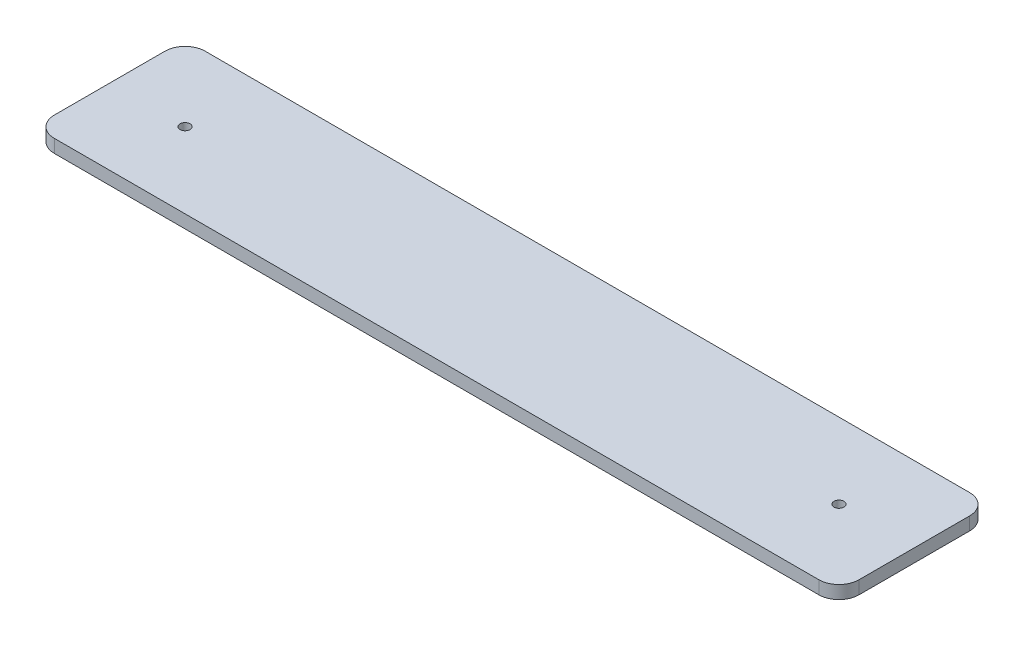
ISO-10303-21;
HEADER;
FILE_DESCRIPTION(('STEP AP214'),'2;1');
FILE_NAME('part.step','',(''),(''),'','','');
FILE_SCHEMA(('AUTOMOTIVE_DESIGN { 1 0 10303 214 1 1 1 1 }'));
ENDSEC;
DATA;
#1=APPLICATION_CONTEXT('core data for automotive mechanical design processes');
#2=APPLICATION_PROTOCOL_DEFINITION('international standard','automotive_design',2000,#1);
#3=PRODUCT_CONTEXT('',#1,'mechanical');
#4=PRODUCT('Part','Part','',(#3));
#5=PRODUCT_RELATED_PRODUCT_CATEGORY('part','',(#4));
#6=PRODUCT_DEFINITION_FORMATION('','',#4);
#7=PRODUCT_DEFINITION_CONTEXT('part definition',#1,'design');
#8=PRODUCT_DEFINITION('design','',#6,#7);
#9=PRODUCT_DEFINITION_SHAPE('','',#8);
#10=(LENGTH_UNIT() NAMED_UNIT(*) SI_UNIT(.MILLI.,.METRE.));
#11=(NAMED_UNIT(*) PLANE_ANGLE_UNIT() SI_UNIT($,.RADIAN.));
#12=(NAMED_UNIT(*) SI_UNIT($,.STERADIAN.) SOLID_ANGLE_UNIT());
#13=UNCERTAINTY_MEASURE_WITH_UNIT(LENGTH_MEASURE(1.E-05),#10,'distance_accuracy_value','');
#14=(GEOMETRIC_REPRESENTATION_CONTEXT(3) GLOBAL_UNCERTAINTY_ASSIGNED_CONTEXT((#13)) GLOBAL_UNIT_ASSIGNED_CONTEXT((#10,
#11,#12)) REPRESENTATION_CONTEXT('',''));
#15=CARTESIAN_POINT('',(0.,0.,0.));
#16=DIRECTION('',(0.,0.,1.));
#17=DIRECTION('',(1.,0.,0.));
#18=AXIS2_PLACEMENT_3D('',#15,#16,#17);
#19=CARTESIAN_POINT('',(0.,6.5,0.));
#20=DIRECTION('',(1.,0.,0.));
#21=DIRECTION('',(0.,0.,-1.));
#22=AXIS2_PLACEMENT_3D('',#19,#20,#21);
#23=PLANE('',#22);
#24=DIRECTION('',(0.,0.,1.));
#25=VECTOR('',#24,1.);
#26=CARTESIAN_POINT('',(0.,0.,0.));
#27=LINE('',#26,#25);
#28=CARTESIAN_POINT('',(0.,0.,-65.));
#29=VERTEX_POINT('',#28);
#30=CARTESIAN_POINT('',(0.,0.,-10.));
#31=VERTEX_POINT('',#30);
#32=EDGE_CURVE('E157',#29,#31,#27,.T.);
#33=ORIENTED_EDGE('',*,*,#32,.T.);
#34=DIRECTION('',(0.,-1.,0.));
#35=VECTOR('',#34,1.);
#36=CARTESIAN_POINT('',(0.,6.5,-10.));
#37=LINE('',#36,#35);
#38=CARTESIAN_POINT('',(0.,6.5,-10.));
#39=VERTEX_POINT('',#38);
#40=EDGE_CURVE('E11',#31,#39,#37,.F.);
#41=ORIENTED_EDGE('',*,*,#40,.T.);
#42=DIRECTION('',(0.,0.,1.));
#43=VECTOR('',#42,1.);
#44=CARTESIAN_POINT('',(0.,6.5,0.));
#45=LINE('',#44,#43);
#46=CARTESIAN_POINT('',(0.,6.5,-65.));
#47=VERTEX_POINT('',#46);
#48=EDGE_CURVE('E125',#47,#39,#45,.T.);
#49=ORIENTED_EDGE('',*,*,#48,.F.);
#50=DIRECTION('',(0.,-1.,0.));
#51=VECTOR('',#50,1.);
#52=CARTESIAN_POINT('',(0.,6.5,-65.));
#53=LINE('',#52,#51);
#54=EDGE_CURVE('E41',#47,#29,#53,.T.);
#55=ORIENTED_EDGE('',*,*,#54,.T.);
#56=EDGE_LOOP('',(#33,#41,#49,#55));
#57=FACE_BOUND('',#56,.T.);
#58=ADVANCED_FACE('F33',(#57),#23,.F.);
#59=CARTESIAN_POINT('',(0.,6.5,0.));
#60=DIRECTION('',(0.,0.,-1.));
#61=DIRECTION('',(-1.,0.,0.));
#62=AXIS2_PLACEMENT_3D('',#59,#60,#61);
#63=PLANE('',#62);
#64=DIRECTION('',(1.,0.,0.));
#65=VECTOR('',#64,1.);
#66=CARTESIAN_POINT('',(0.,0.,0.));
#67=LINE('',#66,#65);
#68=CARTESIAN_POINT('',(10.,0.,0.));
#69=VERTEX_POINT('',#68);
#70=CARTESIAN_POINT('',(390.,0.,0.));
#71=VERTEX_POINT('',#70);
#72=EDGE_CURVE('E130',#69,#71,#67,.T.);
#73=ORIENTED_EDGE('',*,*,#72,.T.);
#74=DIRECTION('',(0.,-1.,0.));
#75=VECTOR('',#74,1.);
#76=CARTESIAN_POINT('',(390.,6.5,0.));
#77=LINE('',#76,#75);
#78=CARTESIAN_POINT('',(390.,6.5,0.));
#79=VERTEX_POINT('',#78);
#80=EDGE_CURVE('E48',#71,#79,#77,.F.);
#81=ORIENTED_EDGE('',*,*,#80,.T.);
#82=DIRECTION('',(1.,0.,0.));
#83=VECTOR('',#82,1.);
#84=CARTESIAN_POINT('',(0.,6.5,0.));
#85=LINE('',#84,#83);
#86=CARTESIAN_POINT('',(10.,6.5,0.));
#87=VERTEX_POINT('',#86);
#88=EDGE_CURVE('E128',#87,#79,#85,.T.);
#89=ORIENTED_EDGE('',*,*,#88,.F.);
#90=DIRECTION('',(0.,-1.,0.));
#91=VECTOR('',#90,1.);
#92=CARTESIAN_POINT('',(10.,6.5,0.));
#93=LINE('',#92,#91);
#94=EDGE_CURVE('E149',#87,#69,#93,.T.);
#95=ORIENTED_EDGE('',*,*,#94,.T.);
#96=EDGE_LOOP('',(#73,#81,#89,#95));
#97=FACE_BOUND('',#96,.T.);
#98=ADVANCED_FACE('F196',(#97),#63,.F.);
#99=CARTESIAN_POINT('',(400.,6.5,0.));
#100=DIRECTION('',(-1.,0.,0.));
#101=DIRECTION('',(0.,0.,1.));
#102=AXIS2_PLACEMENT_3D('',#99,#100,#101);
#103=PLANE('',#102);
#104=DIRECTION('',(0.,0.,-1.));
#105=VECTOR('',#104,1.);
#106=CARTESIAN_POINT('',(400.,0.,0.));
#107=LINE('',#106,#105);
#108=CARTESIAN_POINT('',(400.,0.,-10.));
#109=VERTEX_POINT('',#108);
#110=CARTESIAN_POINT('',(400.,0.,-65.));
#111=VERTEX_POINT('',#110);
#112=EDGE_CURVE('E126',#109,#111,#107,.T.);
#113=ORIENTED_EDGE('',*,*,#112,.T.);
#114=DIRECTION('',(0.,-1.,0.));
#115=VECTOR('',#114,1.);
#116=CARTESIAN_POINT('',(400.,6.5,-65.));
#117=LINE('',#116,#115);
#118=CARTESIAN_POINT('',(400.,6.5,-65.));
#119=VERTEX_POINT('',#118);
#120=EDGE_CURVE('E104',#111,#119,#117,.F.);
#121=ORIENTED_EDGE('',*,*,#120,.T.);
#122=DIRECTION('',(0.,0.,-1.));
#123=VECTOR('',#122,1.);
#124=CARTESIAN_POINT('',(400.,6.5,0.));
#125=LINE('',#124,#123);
#126=CARTESIAN_POINT('',(400.,6.5,-10.));
#127=VERTEX_POINT('',#126);
#128=EDGE_CURVE('E169',#127,#119,#125,.T.);
#129=ORIENTED_EDGE('',*,*,#128,.F.);
#130=DIRECTION('',(0.,-1.,0.));
#131=VECTOR('',#130,1.);
#132=CARTESIAN_POINT('',(400.,6.5,-10.));
#133=LINE('',#132,#131);
#134=EDGE_CURVE('E109',#127,#109,#133,.T.);
#135=ORIENTED_EDGE('',*,*,#134,.T.);
#136=EDGE_LOOP('',(#113,#121,#129,#135));
#137=FACE_BOUND('',#136,.T.);
#138=ADVANCED_FACE('F193',(#137),#103,.F.);
#139=CARTESIAN_POINT('',(0.,6.5,-75.));
#140=DIRECTION('',(0.,0.,1.));
#141=DIRECTION('',(1.,0.,0.));
#142=AXIS2_PLACEMENT_3D('',#139,#140,#141);
#143=PLANE('',#142);
#144=DIRECTION('',(-1.,0.,0.));
#145=VECTOR('',#144,1.);
#146=CARTESIAN_POINT('',(0.,6.5,-75.));
#147=LINE('',#146,#145);
#148=CARTESIAN_POINT('',(390.,6.5,-75.));
#149=VERTEX_POINT('',#148);
#150=CARTESIAN_POINT('',(10.,6.5,-75.));
#151=VERTEX_POINT('',#150);
#152=EDGE_CURVE('E119',#149,#151,#147,.T.);
#153=ORIENTED_EDGE('',*,*,#152,.F.);
#154=DIRECTION('',(0.,-1.,0.));
#155=VECTOR('',#154,1.);
#156=CARTESIAN_POINT('',(390.,6.5,-75.));
#157=LINE('',#156,#155);
#158=CARTESIAN_POINT('',(390.,0.,-75.));
#159=VERTEX_POINT('',#158);
#160=EDGE_CURVE('E103',#149,#159,#157,.T.);
#161=ORIENTED_EDGE('',*,*,#160,.T.);
#162=DIRECTION('',(-1.,0.,0.));
#163=VECTOR('',#162,1.);
#164=CARTESIAN_POINT('',(0.,0.,-75.));
#165=LINE('',#164,#163);
#166=CARTESIAN_POINT('',(10.,0.,-75.));
#167=VERTEX_POINT('',#166);
#168=EDGE_CURVE('E116',#159,#167,#165,.T.);
#169=ORIENTED_EDGE('',*,*,#168,.T.);
#170=DIRECTION('',(0.,-1.,0.));
#171=VECTOR('',#170,1.);
#172=CARTESIAN_POINT('',(10.,6.5,-75.));
#173=LINE('',#172,#171);
#174=EDGE_CURVE('E121',#167,#151,#173,.F.);
#175=ORIENTED_EDGE('',*,*,#174,.T.);
#176=EDGE_LOOP('',(#153,#161,#169,#175));
#177=FACE_BOUND('',#176,.T.);
#178=ADVANCED_FACE('F115',(#177),#143,.F.);
#179=CARTESIAN_POINT('',(0.,6.5,0.));
#180=DIRECTION('',(0.,-1.,0.));
#181=DIRECTION('',(0.,0.,-1.));
#182=AXIS2_PLACEMENT_3D('',#179,#180,#181);
#183=PLANE('',#182);
#184=CARTESIAN_POINT('',(362.5,6.5,-37.5));
#185=DIRECTION('',(0.,1.,0.));
#186=DIRECTION('',(0.,0.,-1.));
#187=AXIS2_PLACEMENT_3D('',#184,#185,#186);
#188=CIRCLE('',#187,2.49999999999996);
#189=CARTESIAN_POINT('',(362.5,6.5,-35.0000000000001));
#190=VERTEX_POINT('',#189);
#191=EDGE_CURVE('E174',#190,#190,#188,.T.);
#192=ORIENTED_EDGE('',*,*,#191,.F.);
#193=EDGE_LOOP('',(#192));
#194=FACE_BOUND('',#193,.T.);
#195=CARTESIAN_POINT('',(37.5,6.5,-37.5));
#196=DIRECTION('',(0.,1.,0.));
#197=DIRECTION('',(0.,0.,1.));
#198=AXIS2_PLACEMENT_3D('',#195,#196,#197);
#199=CIRCLE('',#198,2.5);
#200=CARTESIAN_POINT('',(37.5,6.5,-35.));
#201=VERTEX_POINT('',#200);
#202=EDGE_CURVE('E162',#201,#201,#199,.T.);
#203=ORIENTED_EDGE('',*,*,#202,.F.);
#204=EDGE_LOOP('',(#203));
#205=FACE_BOUND('',#204,.T.);
#206=ORIENTED_EDGE('',*,*,#128,.T.);
#207=CARTESIAN_POINT('',(390.,6.5,-65.));
#208=DIRECTION('',(0.,-1.,0.));
#209=DIRECTION('',(0.,0.,-1.));
#210=AXIS2_PLACEMENT_3D('',#207,#208,#209);
#211=CIRCLE('',#210,10.);
#212=EDGE_CURVE('E147',#119,#149,#211,.F.);
#213=ORIENTED_EDGE('',*,*,#212,.T.);
#214=ORIENTED_EDGE('',*,*,#152,.T.);
#215=CARTESIAN_POINT('',(10.,6.5,-65.));
#216=DIRECTION('',(0.,-1.,0.));
#217=DIRECTION('',(0.,0.,-1.));
#218=AXIS2_PLACEMENT_3D('',#215,#216,#217);
#219=CIRCLE('',#218,10.);
#220=EDGE_CURVE('E142',#151,#47,#219,.F.);
#221=ORIENTED_EDGE('',*,*,#220,.T.);
#222=ORIENTED_EDGE('',*,*,#48,.T.);
#223=CARTESIAN_POINT('',(10.,6.5,-10.));
#224=DIRECTION('',(0.,-1.,0.));
#225=DIRECTION('',(0.,0.,-1.));
#226=AXIS2_PLACEMENT_3D('',#223,#224,#225);
#227=CIRCLE('',#226,10.);
#228=EDGE_CURVE('E55',#39,#87,#227,.F.);
#229=ORIENTED_EDGE('',*,*,#228,.T.);
#230=ORIENTED_EDGE('',*,*,#88,.T.);
#231=CARTESIAN_POINT('',(390.,6.5,-10.));
#232=DIRECTION('',(0.,-1.,0.));
#233=DIRECTION('',(0.,0.,-1.));
#234=AXIS2_PLACEMENT_3D('',#231,#232,#233);
#235=CIRCLE('',#234,10.);
#236=EDGE_CURVE('E145',#79,#127,#235,.F.);
#237=ORIENTED_EDGE('',*,*,#236,.T.);
#238=EDGE_LOOP('',(#206,#213,#214,#221,#222,#229,#230,#237));
#239=FACE_BOUND('',#238,.T.);
#240=ADVANCED_FACE('F184',(#194,#205,#239),#183,.F.);
#241=CARTESIAN_POINT('',(0.,0.,0.));
#242=DIRECTION('',(0.,-1.,0.));
#243=DIRECTION('',(0.,0.,-1.));
#244=AXIS2_PLACEMENT_3D('',#241,#242,#243);
#245=PLANE('',#244);
#246=CARTESIAN_POINT('',(362.5,0.,-37.5));
#247=DIRECTION('',(0.,-1.,0.));
#248=DIRECTION('',(0.,0.,-1.));
#249=AXIS2_PLACEMENT_3D('',#246,#247,#248);
#250=CIRCLE('',#249,2.49999999999996);
#251=CARTESIAN_POINT('',(362.5,0.,-35.0000000000001));
#252=VERTEX_POINT('',#251);
#253=EDGE_CURVE('E176',#252,#252,#250,.F.);
#254=ORIENTED_EDGE('',*,*,#253,.T.);
#255=EDGE_LOOP('',(#254));
#256=FACE_BOUND('',#255,.T.);
#257=CARTESIAN_POINT('',(37.5,0.,-37.5));
#258=DIRECTION('',(0.,-1.,0.));
#259=DIRECTION('',(0.,0.,-1.));
#260=AXIS2_PLACEMENT_3D('',#257,#258,#259);
#261=CIRCLE('',#260,2.5);
#262=CARTESIAN_POINT('',(37.5,0.,-35.));
#263=VERTEX_POINT('',#262);
#264=EDGE_CURVE('E165',#263,#263,#261,.F.);
#265=ORIENTED_EDGE('',*,*,#264,.T.);
#266=EDGE_LOOP('',(#265));
#267=FACE_BOUND('',#266,.T.);
#268=ORIENTED_EDGE('',*,*,#168,.F.);
#269=CARTESIAN_POINT('',(390.,0.,-65.));
#270=DIRECTION('',(0.,-1.,0.));
#271=DIRECTION('',(0.,0.,-1.));
#272=AXIS2_PLACEMENT_3D('',#269,#270,#271);
#273=CIRCLE('',#272,10.);
#274=EDGE_CURVE('E99',#159,#111,#273,.T.);
#275=ORIENTED_EDGE('',*,*,#274,.T.);
#276=ORIENTED_EDGE('',*,*,#112,.F.);
#277=CARTESIAN_POINT('',(390.,0.,-10.));
#278=DIRECTION('',(0.,-1.,0.));
#279=DIRECTION('',(0.,0.,-1.));
#280=AXIS2_PLACEMENT_3D('',#277,#278,#279);
#281=CIRCLE('',#280,10.);
#282=EDGE_CURVE('E110',#109,#71,#281,.T.);
#283=ORIENTED_EDGE('',*,*,#282,.T.);
#284=ORIENTED_EDGE('',*,*,#72,.F.);
#285=CARTESIAN_POINT('',(10.,0.,-10.));
#286=DIRECTION('',(0.,-1.,0.));
#287=DIRECTION('',(0.,0.,-1.));
#288=AXIS2_PLACEMENT_3D('',#285,#286,#287);
#289=CIRCLE('',#288,10.);
#290=EDGE_CURVE('E136',#69,#31,#289,.T.);
#291=ORIENTED_EDGE('',*,*,#290,.T.);
#292=ORIENTED_EDGE('',*,*,#32,.F.);
#293=CARTESIAN_POINT('',(10.,0.,-65.));
#294=DIRECTION('',(0.,-1.,0.));
#295=DIRECTION('',(0.,0.,-1.));
#296=AXIS2_PLACEMENT_3D('',#293,#294,#295);
#297=CIRCLE('',#296,10.);
#298=EDGE_CURVE('E120',#29,#167,#297,.T.);
#299=ORIENTED_EDGE('',*,*,#298,.T.);
#300=EDGE_LOOP('',(#268,#275,#276,#283,#284,#291,#292,#299));
#301=FACE_BOUND('',#300,.T.);
#302=ADVANCED_FACE('F123',(#256,#267,#301),#245,.T.);
#303=CARTESIAN_POINT('',(390.,6.5,-65.));
#304=DIRECTION('',(0.,-1.,0.));
#305=DIRECTION('',(0.,0.,-1.));
#306=AXIS2_PLACEMENT_3D('',#303,#304,#305);
#307=CYLINDRICAL_SURFACE('',#306,10.);
#308=ORIENTED_EDGE('',*,*,#212,.F.);
#309=ORIENTED_EDGE('',*,*,#120,.F.);
#310=ORIENTED_EDGE('',*,*,#274,.F.);
#311=ORIENTED_EDGE('',*,*,#160,.F.);
#312=EDGE_LOOP('',(#308,#309,#310,#311));
#313=FACE_BOUND('',#312,.T.);
#314=ADVANCED_FACE('F102',(#313),#307,.T.);
#315=CARTESIAN_POINT('',(390.,6.5,-10.));
#316=DIRECTION('',(0.,-1.,0.));
#317=DIRECTION('',(0.,0.,-1.));
#318=AXIS2_PLACEMENT_3D('',#315,#316,#317);
#319=CYLINDRICAL_SURFACE('',#318,10.);
#320=ORIENTED_EDGE('',*,*,#236,.F.);
#321=ORIENTED_EDGE('',*,*,#80,.F.);
#322=ORIENTED_EDGE('',*,*,#282,.F.);
#323=ORIENTED_EDGE('',*,*,#134,.F.);
#324=EDGE_LOOP('',(#320,#321,#322,#323));
#325=FACE_BOUND('',#324,.T.);
#326=ADVANCED_FACE('F195',(#325),#319,.T.);
#327=CARTESIAN_POINT('',(10.,6.5,-10.));
#328=DIRECTION('',(0.,-1.,0.));
#329=DIRECTION('',(0.,0.,-1.));
#330=AXIS2_PLACEMENT_3D('',#327,#328,#329);
#331=CYLINDRICAL_SURFACE('',#330,10.);
#332=ORIENTED_EDGE('',*,*,#228,.F.);
#333=ORIENTED_EDGE('',*,*,#40,.F.);
#334=ORIENTED_EDGE('',*,*,#290,.F.);
#335=ORIENTED_EDGE('',*,*,#94,.F.);
#336=EDGE_LOOP('',(#332,#333,#334,#335));
#337=FACE_BOUND('',#336,.T.);
#338=ADVANCED_FACE('F199',(#337),#331,.T.);
#339=CARTESIAN_POINT('',(10.,6.5,-65.));
#340=DIRECTION('',(0.,-1.,0.));
#341=DIRECTION('',(0.,0.,-1.));
#342=AXIS2_PLACEMENT_3D('',#339,#340,#341);
#343=CYLINDRICAL_SURFACE('',#342,10.);
#344=ORIENTED_EDGE('',*,*,#220,.F.);
#345=ORIENTED_EDGE('',*,*,#174,.F.);
#346=ORIENTED_EDGE('',*,*,#298,.F.);
#347=ORIENTED_EDGE('',*,*,#54,.F.);
#348=EDGE_LOOP('',(#344,#345,#346,#347));
#349=FACE_BOUND('',#348,.T.);
#350=ADVANCED_FACE('F35',(#349),#343,.T.);
#351=CARTESIAN_POINT('',(37.5,-0.00100000000000013,-37.5));
#352=DIRECTION('',(0.,1.,0.));
#353=DIRECTION('',(0.,0.,1.));
#354=AXIS2_PLACEMENT_3D('',#351,#352,#353);
#355=CYLINDRICAL_SURFACE('',#354,2.5);
#356=CARTESIAN_POINT('',(37.5,0.,-35.));
#357=CARTESIAN_POINT('',(37.5,0.0677083333333333,-35.));
#358=CARTESIAN_POINT('',(37.5,0.135416666666667,-35.));
#359=CARTESIAN_POINT('',(37.5,0.270833333333333,-35.));
#360=CARTESIAN_POINT('',(37.5,0.338541666666667,-35.));
#361=CARTESIAN_POINT('',(37.5,0.473958333333333,-35.));
#362=CARTESIAN_POINT('',(37.5,0.541666666666667,-35.));
#363=CARTESIAN_POINT('',(37.5,0.677083333333333,-35.));
#364=CARTESIAN_POINT('',(37.5,0.744791666666667,-35.));
#365=CARTESIAN_POINT('',(37.5,0.880208333333333,-35.));
#366=CARTESIAN_POINT('',(37.5,0.947916666666666,-35.));
#367=CARTESIAN_POINT('',(37.5,1.08333333333333,-35.));
#368=CARTESIAN_POINT('',(37.5,1.15104166666667,-35.));
#369=CARTESIAN_POINT('',(37.5,1.28645833333333,-35.));
#370=CARTESIAN_POINT('',(37.5,1.35416666666667,-35.));
#371=CARTESIAN_POINT('',(37.5,1.48958333333333,-35.));
#372=CARTESIAN_POINT('',(37.5,1.55729166666667,-35.));
#373=CARTESIAN_POINT('',(37.5,1.69270833333333,-35.));
#374=CARTESIAN_POINT('',(37.5,1.76041666666667,-35.));
#375=CARTESIAN_POINT('',(37.5,1.89583333333333,-35.));
#376=CARTESIAN_POINT('',(37.5,1.96354166666667,-35.));
#377=CARTESIAN_POINT('',(37.5,2.09895833333333,-35.));
#378=CARTESIAN_POINT('',(37.5,2.16666666666667,-35.));
#379=CARTESIAN_POINT('',(37.5,2.30208333333333,-35.));
#380=CARTESIAN_POINT('',(37.5,2.36979166666667,-35.));
#381=CARTESIAN_POINT('',(37.5,2.50520833333333,-35.));
#382=CARTESIAN_POINT('',(37.5,2.57291666666667,-35.));
#383=CARTESIAN_POINT('',(37.5,2.70833333333333,-35.));
#384=CARTESIAN_POINT('',(37.5,2.77604166666667,-35.));
#385=CARTESIAN_POINT('',(37.5,2.91145833333333,-35.));
#386=CARTESIAN_POINT('',(37.5,2.97916666666667,-35.));
#387=CARTESIAN_POINT('',(37.5,3.11458333333333,-35.));
#388=CARTESIAN_POINT('',(37.5,3.18229166666667,-35.));
#389=CARTESIAN_POINT('',(37.5,3.31770833333333,-35.));
#390=CARTESIAN_POINT('',(37.5,3.38541666666667,-35.));
#391=CARTESIAN_POINT('',(37.5,3.52083333333333,-35.));
#392=CARTESIAN_POINT('',(37.5,3.58854166666667,-35.));
#393=CARTESIAN_POINT('',(37.5,3.72395833333333,-35.));
#394=CARTESIAN_POINT('',(37.5,3.79166666666667,-35.));
#395=CARTESIAN_POINT('',(37.5,3.92708333333333,-35.));
#396=CARTESIAN_POINT('',(37.5,3.99479166666667,-35.));
#397=CARTESIAN_POINT('',(37.5,4.13020833333333,-35.));
#398=CARTESIAN_POINT('',(37.5,4.19791666666667,-35.));
#399=CARTESIAN_POINT('',(37.5,4.33333333333333,-35.));
#400=CARTESIAN_POINT('',(37.5,4.40104166666667,-35.));
#401=CARTESIAN_POINT('',(37.5,4.53645833333333,-35.));
#402=CARTESIAN_POINT('',(37.5,4.60416666666667,-35.));
#403=CARTESIAN_POINT('',(37.5,4.73958333333333,-35.));
#404=CARTESIAN_POINT('',(37.5,4.80729166666667,-35.));
#405=CARTESIAN_POINT('',(37.5,4.94270833333333,-35.));
#406=CARTESIAN_POINT('',(37.5,5.01041666666667,-35.));
#407=CARTESIAN_POINT('',(37.5,5.14583333333333,-35.));
#408=CARTESIAN_POINT('',(37.5,5.21354166666667,-35.));
#409=CARTESIAN_POINT('',(37.5,5.34895833333333,-35.));
#410=CARTESIAN_POINT('',(37.5,5.41666666666667,-35.));
#411=CARTESIAN_POINT('',(37.5,5.55208333333333,-35.));
#412=CARTESIAN_POINT('',(37.5,5.61979166666667,-35.));
#413=CARTESIAN_POINT('',(37.5,5.75520833333333,-35.));
#414=CARTESIAN_POINT('',(37.5,5.82291666666667,-35.));
#415=CARTESIAN_POINT('',(37.5,5.95833333333333,-35.));
#416=CARTESIAN_POINT('',(37.5,6.02604166666667,-35.));
#417=CARTESIAN_POINT('',(37.5,6.16145833333333,-35.));
#418=CARTESIAN_POINT('',(37.5,6.22916666666667,-35.));
#419=CARTESIAN_POINT('',(37.5,6.36458333333333,-35.));
#420=CARTESIAN_POINT('',(37.5,6.43229166666667,-35.));
#421=CARTESIAN_POINT('',(37.5,6.5,-35.));
#422=B_SPLINE_CURVE_WITH_KNOTS('',3,(#356,#357,#358,#359,#360,#361,#362,#363,#364,#365,#366,
#367,#368,#369,#370,#371,#372,#373,#374,#375,#376,#377,#378,#379,#380,#381,#382,#383,#384,#385,
#386,#387,#388,#389,#390,#391,#392,#393,#394,#395,#396,#397,#398,#399,#400,#401,#402,#403,#404,
#405,#406,#407,#408,#409,#410,#411,#412,#413,#414,#415,#416,#417,#418,#419,#420,#421),
.UNSPECIFIED.,.F.,.F.,(4,2,2,2,2,2,2,2,2,2,2,2,2,2,2,2,2,2,2,2,2,2,2,2,2,2,2,2,2,2,2,2,4),(0.,
0.203125,0.40625,0.609375,0.8125,1.015625,1.21875,1.421875,1.625,1.828125,2.03125,2.234375,
2.4375,2.640625,2.84375,3.046875,3.25,3.453125,3.65625,3.859375,4.0625,4.265625,4.46875,
4.671875,4.875,5.078125,5.28125,5.484375,5.6875,5.890625,6.09375,6.296875,6.5),.UNSPECIFIED.);
#423=EDGE_CURVE('BSEAM201',#263,#201,#422,.T.);
#424=ORIENTED_EDGE('',*,*,#264,.F.);
#425=ORIENTED_EDGE('',*,*,#202,.T.);
#426=ORIENTED_EDGE('',*,*,#423,.T.);
#427=ORIENTED_EDGE('',*,*,#423,.F.);
#428=EDGE_LOOP('',(#424,#426,#425,#427));
#429=FACE_BOUND('',#428,.T.);
#430=ADVANCED_FACE('F201',(#429),#355,.F.);
#431=CARTESIAN_POINT('',(362.5,-0.00100000000000013,-37.5));
#432=DIRECTION('',(0.,1.,0.));
#433=DIRECTION('',(0.,0.,1.));
#434=AXIS2_PLACEMENT_3D('',#431,#432,#433);
#435=CYLINDRICAL_SURFACE('',#434,2.49999999999996);
#436=CARTESIAN_POINT('',(362.5,0.,-35.0000000000001));
#437=CARTESIAN_POINT('',(362.5,0.0677083333333333,-35.0000000000001));
#438=CARTESIAN_POINT('',(362.5,0.135416666666667,-35.0000000000001));
#439=CARTESIAN_POINT('',(362.5,0.270833333333333,-35.0000000000001));
#440=CARTESIAN_POINT('',(362.5,0.338541666666667,-35.0000000000001));
#441=CARTESIAN_POINT('',(362.5,0.473958333333333,-35.0000000000001));
#442=CARTESIAN_POINT('',(362.5,0.541666666666667,-35.0000000000001));
#443=CARTESIAN_POINT('',(362.5,0.677083333333333,-35.0000000000001));
#444=CARTESIAN_POINT('',(362.5,0.744791666666667,-35.0000000000001));
#445=CARTESIAN_POINT('',(362.5,0.880208333333333,-35.0000000000001));
#446=CARTESIAN_POINT('',(362.5,0.947916666666666,-35.0000000000001));
#447=CARTESIAN_POINT('',(362.5,1.08333333333333,-35.0000000000001));
#448=CARTESIAN_POINT('',(362.5,1.15104166666667,-35.0000000000001));
#449=CARTESIAN_POINT('',(362.5,1.28645833333333,-35.0000000000001));
#450=CARTESIAN_POINT('',(362.5,1.35416666666667,-35.0000000000001));
#451=CARTESIAN_POINT('',(362.5,1.48958333333333,-35.0000000000001));
#452=CARTESIAN_POINT('',(362.5,1.55729166666667,-35.0000000000001));
#453=CARTESIAN_POINT('',(362.5,1.69270833333333,-35.0000000000001));
#454=CARTESIAN_POINT('',(362.5,1.76041666666667,-35.0000000000001));
#455=CARTESIAN_POINT('',(362.5,1.89583333333333,-35.0000000000001));
#456=CARTESIAN_POINT('',(362.5,1.96354166666667,-35.0000000000001));
#457=CARTESIAN_POINT('',(362.5,2.09895833333333,-35.0000000000001));
#458=CARTESIAN_POINT('',(362.5,2.16666666666667,-35.0000000000001));
#459=CARTESIAN_POINT('',(362.5,2.30208333333333,-35.0000000000001));
#460=CARTESIAN_POINT('',(362.5,2.36979166666667,-35.0000000000001));
#461=CARTESIAN_POINT('',(362.5,2.50520833333333,-35.0000000000001));
#462=CARTESIAN_POINT('',(362.5,2.57291666666667,-35.0000000000001));
#463=CARTESIAN_POINT('',(362.5,2.70833333333333,-35.0000000000001));
#464=CARTESIAN_POINT('',(362.5,2.77604166666667,-35.0000000000001));
#465=CARTESIAN_POINT('',(362.5,2.91145833333333,-35.0000000000001));
#466=CARTESIAN_POINT('',(362.5,2.97916666666667,-35.0000000000001));
#467=CARTESIAN_POINT('',(362.5,3.11458333333333,-35.0000000000001));
#468=CARTESIAN_POINT('',(362.5,3.18229166666667,-35.0000000000001));
#469=CARTESIAN_POINT('',(362.5,3.31770833333333,-35.0000000000001));
#470=CARTESIAN_POINT('',(362.5,3.38541666666667,-35.0000000000001));
#471=CARTESIAN_POINT('',(362.5,3.52083333333333,-35.0000000000001));
#472=CARTESIAN_POINT('',(362.5,3.58854166666667,-35.0000000000001));
#473=CARTESIAN_POINT('',(362.5,3.72395833333333,-35.0000000000001));
#474=CARTESIAN_POINT('',(362.5,3.79166666666667,-35.0000000000001));
#475=CARTESIAN_POINT('',(362.5,3.92708333333333,-35.0000000000001));
#476=CARTESIAN_POINT('',(362.5,3.99479166666667,-35.0000000000001));
#477=CARTESIAN_POINT('',(362.5,4.13020833333333,-35.0000000000001));
#478=CARTESIAN_POINT('',(362.5,4.19791666666667,-35.0000000000001));
#479=CARTESIAN_POINT('',(362.5,4.33333333333333,-35.0000000000001));
#480=CARTESIAN_POINT('',(362.5,4.40104166666667,-35.0000000000001));
#481=CARTESIAN_POINT('',(362.5,4.53645833333333,-35.0000000000001));
#482=CARTESIAN_POINT('',(362.5,4.60416666666667,-35.0000000000001));
#483=CARTESIAN_POINT('',(362.5,4.73958333333333,-35.0000000000001));
#484=CARTESIAN_POINT('',(362.5,4.80729166666667,-35.0000000000001));
#485=CARTESIAN_POINT('',(362.5,4.94270833333333,-35.0000000000001));
#486=CARTESIAN_POINT('',(362.5,5.01041666666667,-35.0000000000001));
#487=CARTESIAN_POINT('',(362.5,5.14583333333333,-35.0000000000001));
#488=CARTESIAN_POINT('',(362.5,5.21354166666667,-35.0000000000001));
#489=CARTESIAN_POINT('',(362.5,5.34895833333333,-35.0000000000001));
#490=CARTESIAN_POINT('',(362.5,5.41666666666667,-35.0000000000001));
#491=CARTESIAN_POINT('',(362.5,5.55208333333333,-35.0000000000001));
#492=CARTESIAN_POINT('',(362.5,5.61979166666667,-35.0000000000001));
#493=CARTESIAN_POINT('',(362.5,5.75520833333333,-35.0000000000001));
#494=CARTESIAN_POINT('',(362.5,5.82291666666667,-35.0000000000001));
#495=CARTESIAN_POINT('',(362.5,5.95833333333333,-35.0000000000001));
#496=CARTESIAN_POINT('',(362.5,6.02604166666667,-35.0000000000001));
#497=CARTESIAN_POINT('',(362.5,6.16145833333333,-35.0000000000001));
#498=CARTESIAN_POINT('',(362.5,6.22916666666667,-35.0000000000001));
#499=CARTESIAN_POINT('',(362.5,6.36458333333333,-35.0000000000001));
#500=CARTESIAN_POINT('',(362.5,6.43229166666667,-35.0000000000001));
#501=CARTESIAN_POINT('',(362.5,6.5,-35.0000000000001));
#502=B_SPLINE_CURVE_WITH_KNOTS('',3,(#436,#437,#438,#439,#440,#441,#442,#443,#444,#445,#446,
#447,#448,#449,#450,#451,#452,#453,#454,#455,#456,#457,#458,#459,#460,#461,#462,#463,#464,#465,
#466,#467,#468,#469,#470,#471,#472,#473,#474,#475,#476,#477,#478,#479,#480,#481,#482,#483,#484,
#485,#486,#487,#488,#489,#490,#491,#492,#493,#494,#495,#496,#497,#498,#499,#500,#501),
.UNSPECIFIED.,.F.,.F.,(4,2,2,2,2,2,2,2,2,2,2,2,2,2,2,2,2,2,2,2,2,2,2,2,2,2,2,2,2,2,2,2,4),(0.,
0.203125,0.40625,0.609375,0.8125,1.015625,1.21875,1.421875,1.625,1.828125,2.03125,2.234375,
2.4375,2.640625,2.84375,3.046875,3.25,3.453125,3.65625,3.859375,4.0625,4.265625,4.46875,
4.671875,4.875,5.078125,5.28125,5.484375,5.6875,5.890625,6.09375,6.296875,6.5),.UNSPECIFIED.);
#503=EDGE_CURVE('BSEAM182',#252,#190,#502,.T.);
#504=ORIENTED_EDGE('',*,*,#253,.F.);
#505=ORIENTED_EDGE('',*,*,#191,.T.);
#506=ORIENTED_EDGE('',*,*,#503,.T.);
#507=ORIENTED_EDGE('',*,*,#503,.F.);
#508=EDGE_LOOP('',(#504,#506,#505,#507));
#509=FACE_BOUND('',#508,.T.);
#510=ADVANCED_FACE('F182',(#509),#435,.F.);
#511=CLOSED_SHELL('',(#58,#98,#138,#178,#240,#302,#314,#326,#338,#350,#430,#510));
#512=MANIFOLD_SOLID_BREP('B2',#511);
#513=ADVANCED_BREP_SHAPE_REPRESENTATION('',(#18,#512),#14);
#514=SHAPE_DEFINITION_REPRESENTATION(#9,#513);
ENDSEC;
END-ISO-10303-21;
